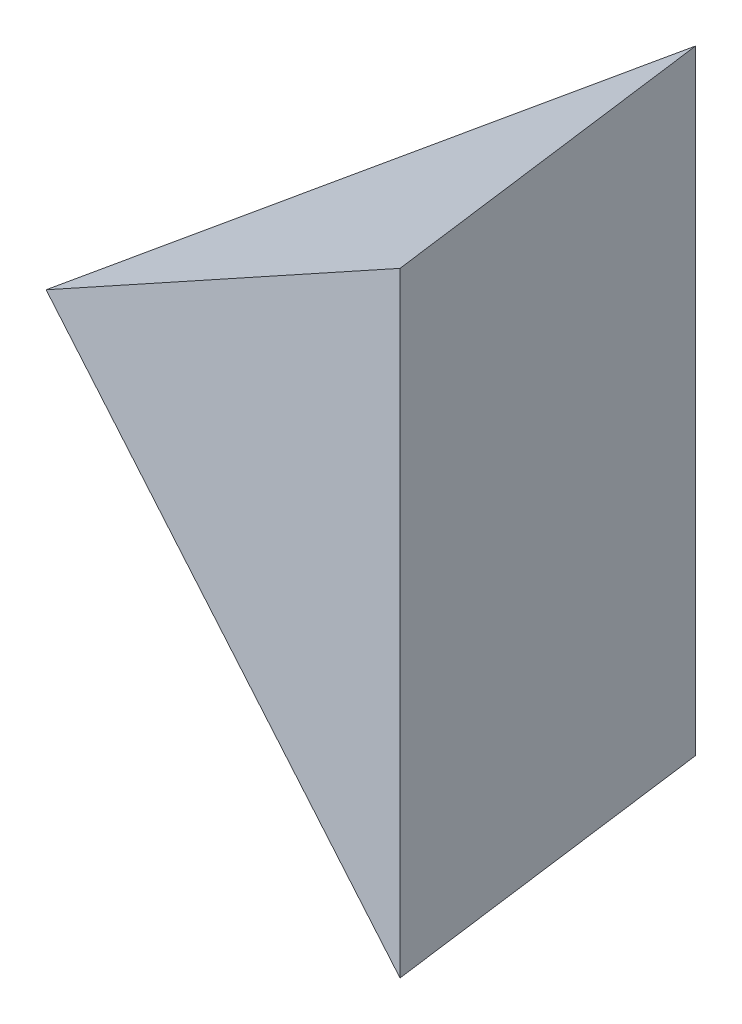
ISO-10303-21;
HEADER;
FILE_DESCRIPTION(('STEP AP214'),'2;1');
FILE_NAME('part.step','',(''),(''),'','','');
FILE_SCHEMA(('AUTOMOTIVE_DESIGN { 1 0 10303 214 1 1 1 1 }'));
ENDSEC;
DATA;
#1=APPLICATION_CONTEXT('core data for automotive mechanical design processes');
#2=APPLICATION_PROTOCOL_DEFINITION('international standard','automotive_design',2000,#1);
#3=PRODUCT_CONTEXT('',#1,'mechanical');
#4=PRODUCT('Part','Part','',(#3));
#5=PRODUCT_RELATED_PRODUCT_CATEGORY('part','',(#4));
#6=PRODUCT_DEFINITION_FORMATION('','',#4);
#7=PRODUCT_DEFINITION_CONTEXT('part definition',#1,'design');
#8=PRODUCT_DEFINITION('design','',#6,#7);
#9=PRODUCT_DEFINITION_SHAPE('','',#8);
#10=(LENGTH_UNIT() NAMED_UNIT(*) SI_UNIT(.MILLI.,.METRE.));
#11=(NAMED_UNIT(*) PLANE_ANGLE_UNIT() SI_UNIT($,.RADIAN.));
#12=(NAMED_UNIT(*) SI_UNIT($,.STERADIAN.) SOLID_ANGLE_UNIT());
#13=UNCERTAINTY_MEASURE_WITH_UNIT(LENGTH_MEASURE(1.E-05),#10,'distance_accuracy_value','');
#14=(GEOMETRIC_REPRESENTATION_CONTEXT(3) GLOBAL_UNCERTAINTY_ASSIGNED_CONTEXT((#13)) GLOBAL_UNIT_ASSIGNED_CONTEXT((#10,
#11,#12)) REPRESENTATION_CONTEXT('',''));
#15=CARTESIAN_POINT('',(0.,0.,0.));
#16=DIRECTION('',(0.,0.,1.));
#17=DIRECTION('',(1.,0.,0.));
#18=AXIS2_PLACEMENT_3D('',#15,#16,#17);
#19=CARTESIAN_POINT('',(719.003578448,376.1404793008,235.44354899558));
#20=DIRECTION('',(-0.99144486137382,0.,0.130526192219976));
#21=DIRECTION('',(0.,1.,0.));
#22=AXIS2_PLACEMENT_3D('',#19,#20,#21);
#23=PLANE('',#22);
#24=DIRECTION('',(0.,-1.,0.));
#25=VECTOR('',#24,1.);
#26=CARTESIAN_POINT('',(719.003578448,376.1404793008,235.44354899558));
#27=LINE('',#26,#25);
#28=CARTESIAN_POINT('',(719.003578448,376.1404793008,235.44354899558));
#29=VERTEX_POINT('',#28);
#30=CARTESIAN_POINT('',(719.003578448,-311.1404793008,235.44354899558));
#31=VERTEX_POINT('',#30);
#32=EDGE_CURVE('E80',#29,#31,#27,.T.);
#33=ORIENTED_EDGE('',*,*,#32,.T.);
#34=DIRECTION('',(-0.130526192219976,0.,-0.99144486137382));
#35=VECTOR('',#34,1.);
#36=CARTESIAN_POINT('',(719.003578448,-311.1404793008,235.44354899558));
#37=LINE('',#36,#35);
#38=CARTESIAN_POINT('',(668.8992676246,-311.1404793008,-145.1364760064));
#39=VERTEX_POINT('',#38);
#40=EDGE_CURVE('E20',#31,#39,#37,.T.);
#41=ORIENTED_EDGE('',*,*,#40,.T.);
#42=DIRECTION('',(0.,1.,0.));
#43=VECTOR('',#42,1.);
#44=CARTESIAN_POINT('',(668.8992676246,-311.1404793008,-145.1364760064));
#45=LINE('',#44,#43);
#46=CARTESIAN_POINT('',(668.8992676246,376.1404793008,-145.1364760064));
#47=VERTEX_POINT('',#46);
#48=EDGE_CURVE('E72',#39,#47,#45,.T.);
#49=ORIENTED_EDGE('',*,*,#48,.T.);
#50=DIRECTION('',(0.130526192219976,0.,0.99144486137382));
#51=VECTOR('',#50,1.);
#52=CARTESIAN_POINT('',(668.8992676246,376.1404793008,-145.1364760064));
#53=LINE('',#52,#51);
#54=EDGE_CURVE('E9',#47,#29,#53,.T.);
#55=ORIENTED_EDGE('',*,*,#54,.T.);
#56=EDGE_LOOP('',(#33,#41,#49,#55));
#57=FACE_BOUND('',#56,.T.);
#58=ADVANCED_FACE('F14',(#57),#23,.F.);
#59=CARTESIAN_POINT('',(198.7497669355,32.843640479301,110.54165952096));
#60=DIRECTION('',(-0.99144486137382,0.,0.130526192219976));
#61=DIRECTION('',(0.,1.,0.));
#62=AXIS2_PLACEMENT_3D('',#59,#60,#61);
#63=PLANE('',#62);
#64=DIRECTION('',(0.130526192219976,0.,0.99144486137382));
#65=VECTOR('',#64,1.);
#66=CARTESIAN_POINT('',(198.69966262467,32.843640479301,110.16107949596));
#67=LINE('',#66,#65);
#68=CARTESIAN_POINT('',(198.69966262467,32.843640479301,110.16107949596));
#69=VERTEX_POINT('',#68);
#70=CARTESIAN_POINT('',(198.7497669355,32.843640479301,110.54165952096));
#71=VERTEX_POINT('',#70);
#72=EDGE_CURVE('E27',#69,#71,#67,.T.);
#73=ORIENTED_EDGE('',*,*,#72,.F.);
#74=DIRECTION('',(0.,1.,0.));
#75=VECTOR('',#74,1.);
#76=CARTESIAN_POINT('',(198.69966262467,32.156359520699,110.16107949596));
#77=LINE('',#76,#75);
#78=CARTESIAN_POINT('',(198.69966262467,32.156359520699,110.16107949596));
#79=VERTEX_POINT('',#78);
#80=EDGE_CURVE('E97',#79,#69,#77,.T.);
#81=ORIENTED_EDGE('',*,*,#80,.F.);
#82=DIRECTION('',(-0.130526192219976,0.,-0.99144486137382));
#83=VECTOR('',#82,1.);
#84=CARTESIAN_POINT('',(198.7497669355,32.156359520699,110.54165952096));
#85=LINE('',#84,#83);
#86=CARTESIAN_POINT('',(198.7497669355,32.156359520699,110.54165952096));
#87=VERTEX_POINT('',#86);
#88=EDGE_CURVE('E82',#87,#79,#85,.T.);
#89=ORIENTED_EDGE('',*,*,#88,.F.);
#90=DIRECTION('',(0.,-1.,0.));
#91=VECTOR('',#90,1.);
#92=CARTESIAN_POINT('',(198.7497669355,32.843640479301,110.54165952096));
#93=LINE('',#92,#91);
#94=EDGE_CURVE('E78',#71,#87,#93,.T.);
#95=ORIENTED_EDGE('',*,*,#94,.F.);
#96=EDGE_LOOP('',(#73,#81,#89,#95));
#97=FACE_BOUND('',#96,.T.);
#98=ADVANCED_FACE('F84',(#97),#63,.T.);
#99=CARTESIAN_POINT('',(198.69966262467,32.843640479301,110.16107949596));
#100=CARTESIAN_POINT('',(668.8992676246,376.1404793008,-145.1364760064));
#101=CARTESIAN_POINT('',(198.7497669355,32.843640479301,110.54165952096));
#102=CARTESIAN_POINT('',(719.003578448,376.1404793008,235.44354899558));
#103=(BOUNDED_SURFACE() B_SPLINE_SURFACE(1,1,((#99,#100),(#101,#102)),.UNSPECIFIED.,.F.,.F.,
.F.) B_SPLINE_SURFACE_WITH_KNOTS((2,2),(2,2),(0.,383.86403503541),(0.,1.),
.UNSPECIFIED.) GEOMETRIC_REPRESENTATION_ITEM() RATIONAL_B_SPLINE_SURFACE(((1.,1.),(1.,1.))) REPRESENTATION_ITEM('') SURFACE());
#104=CARTESIAN_POINT('',(198.7497669355,32.843640479301,110.54165952096));
#105=CARTESIAN_POINT('',(719.003578448,376.1404793008,235.44354899558));
#106=(BOUNDED_CURVE() B_SPLINE_CURVE(1,(#104,#105),.UNSPECIFIED.,.F.,
.F.) B_SPLINE_CURVE_WITH_KNOTS((2,2),(0.,1.),
.UNSPECIFIED.) CURVE() GEOMETRIC_REPRESENTATION_ITEM() RATIONAL_B_SPLINE_CURVE((1.,1.)) REPRESENTATION_ITEM(''));
#107=EDGE_CURVE('E64',#71,#29,#106,.T.);
#108=CARTESIAN_POINT('',(198.69966262467,32.843640479301,110.16107949596));
#109=CARTESIAN_POINT('',(668.8992676246,376.1404793008,-145.1364760064));
#110=(BOUNDED_CURVE() B_SPLINE_CURVE(1,(#108,#109),.UNSPECIFIED.,.F.,
.F.) B_SPLINE_CURVE_WITH_KNOTS((2,2),(0.,1.),
.UNSPECIFIED.) CURVE() GEOMETRIC_REPRESENTATION_ITEM() RATIONAL_B_SPLINE_CURVE((1.,1.)) REPRESENTATION_ITEM(''));
#111=EDGE_CURVE('E67',#69,#47,#110,.T.);
#112=ORIENTED_EDGE('',*,*,#72,.T.);
#113=ORIENTED_EDGE('',*,*,#107,.T.);
#114=ORIENTED_EDGE('',*,*,#54,.F.);
#115=ORIENTED_EDGE('',*,*,#111,.F.);
#116=EDGE_LOOP('',(#112,#113,#114,#115));
#117=FACE_BOUND('',#116,.T.);
#118=ADVANCED_FACE('F63',(#117),#103,.T.);
#119=CARTESIAN_POINT('',(198.69966262467,32.156359520699,110.16107949596));
#120=CARTESIAN_POINT('',(668.8992676246,-311.1404793008,-145.1364760064));
#121=CARTESIAN_POINT('',(198.69966262467,32.843640479301,110.16107949596));
#122=CARTESIAN_POINT('',(668.8992676246,376.1404793008,-145.1364760064));
#123=(BOUNDED_SURFACE() B_SPLINE_SURFACE(1,1,((#119,#120),(#121,#122)),.UNSPECIFIED.,.F.,.F.,
.F.) B_SPLINE_SURFACE_WITH_KNOTS((2,2),(2,2),(0.,687.28095860161),(0.,1.),
.UNSPECIFIED.) GEOMETRIC_REPRESENTATION_ITEM() RATIONAL_B_SPLINE_SURFACE(((1.,1.),(1.,1.))) REPRESENTATION_ITEM('') SURFACE());
#124=CARTESIAN_POINT('',(198.69966262467,32.156359520699,110.16107949596));
#125=CARTESIAN_POINT('',(668.8992676246,-311.1404793008,-145.1364760064));
#126=(BOUNDED_CURVE() B_SPLINE_CURVE(1,(#124,#125),.UNSPECIFIED.,.F.,
.F.) B_SPLINE_CURVE_WITH_KNOTS((2,2),(0.,1.),
.UNSPECIFIED.) CURVE() GEOMETRIC_REPRESENTATION_ITEM() RATIONAL_B_SPLINE_CURVE((1.,1.)) REPRESENTATION_ITEM(''));
#127=EDGE_CURVE('E107',#79,#39,#126,.T.);
#128=ORIENTED_EDGE('',*,*,#80,.T.);
#129=ORIENTED_EDGE('',*,*,#111,.T.);
#130=ORIENTED_EDGE('',*,*,#48,.F.);
#131=ORIENTED_EDGE('',*,*,#127,.F.);
#132=EDGE_LOOP('',(#128,#129,#130,#131));
#133=FACE_BOUND('',#132,.T.);
#134=ADVANCED_FACE('F140',(#133),#123,.T.);
#135=CARTESIAN_POINT('',(198.7497669355,32.156359520699,110.54165952096));
#136=CARTESIAN_POINT('',(719.003578448,-311.1404793008,235.44354899558));
#137=CARTESIAN_POINT('',(198.69966262467,32.156359520699,110.16107949596));
#138=CARTESIAN_POINT('',(668.8992676246,-311.1404793008,-145.1364760064));
#139=(BOUNDED_SURFACE() B_SPLINE_SURFACE(1,1,((#135,#136),(#137,#138)),.UNSPECIFIED.,.F.,.F.,
.F.) B_SPLINE_SURFACE_WITH_KNOTS((2,2),(2,2),(0.,383.86403503541),(0.,1.),
.UNSPECIFIED.) GEOMETRIC_REPRESENTATION_ITEM() RATIONAL_B_SPLINE_SURFACE(((1.,1.),(1.,1.))) REPRESENTATION_ITEM('') SURFACE());
#140=CARTESIAN_POINT('',(198.7497669355,32.156359520699,110.54165952096));
#141=CARTESIAN_POINT('',(719.003578448,-311.1404793008,235.44354899558));
#142=(BOUNDED_CURVE() B_SPLINE_CURVE(1,(#140,#141),.UNSPECIFIED.,.F.,
.F.) B_SPLINE_CURVE_WITH_KNOTS((2,2),(0.,1.),
.UNSPECIFIED.) CURVE() GEOMETRIC_REPRESENTATION_ITEM() RATIONAL_B_SPLINE_CURVE((1.,1.)) REPRESENTATION_ITEM(''));
#143=EDGE_CURVE('E88',#87,#31,#142,.T.);
#144=ORIENTED_EDGE('',*,*,#88,.T.);
#145=ORIENTED_EDGE('',*,*,#127,.T.);
#146=ORIENTED_EDGE('',*,*,#40,.F.);
#147=ORIENTED_EDGE('',*,*,#143,.F.);
#148=EDGE_LOOP('',(#144,#145,#146,#147));
#149=FACE_BOUND('',#148,.T.);
#150=ADVANCED_FACE('F16',(#149),#139,.T.);
#151=CARTESIAN_POINT('',(198.7497669355,32.843640479301,110.54165952096));
#152=CARTESIAN_POINT('',(719.003578448,376.1404793008,235.44354899558));
#153=CARTESIAN_POINT('',(198.7497669355,32.156359520699,110.54165952096));
#154=CARTESIAN_POINT('',(719.003578448,-311.1404793008,235.44354899558));
#155=(BOUNDED_SURFACE() B_SPLINE_SURFACE(1,1,((#151,#152),(#153,#154)),.UNSPECIFIED.,.F.,.F.,
.F.) B_SPLINE_SURFACE_WITH_KNOTS((2,2),(2,2),(0.,687.28095860161),(0.,1.),
.UNSPECIFIED.) GEOMETRIC_REPRESENTATION_ITEM() RATIONAL_B_SPLINE_SURFACE(((1.,1.),(1.,1.))) REPRESENTATION_ITEM('') SURFACE());
#156=ORIENTED_EDGE('',*,*,#94,.T.);
#157=ORIENTED_EDGE('',*,*,#143,.T.);
#158=ORIENTED_EDGE('',*,*,#32,.F.);
#159=ORIENTED_EDGE('',*,*,#107,.F.);
#160=EDGE_LOOP('',(#156,#157,#158,#159));
#161=FACE_BOUND('',#160,.T.);
#162=ADVANCED_FACE('F76',(#161),#155,.T.);
#163=CLOSED_SHELL('',(#58,#98,#118,#134,#150,#162));
#164=MANIFOLD_SOLID_BREP('B1',#163);
#165=ADVANCED_BREP_SHAPE_REPRESENTATION('',(#18,#164),#14);
#166=SHAPE_DEFINITION_REPRESENTATION(#9,#165);
ENDSEC;
END-ISO-10303-21;
